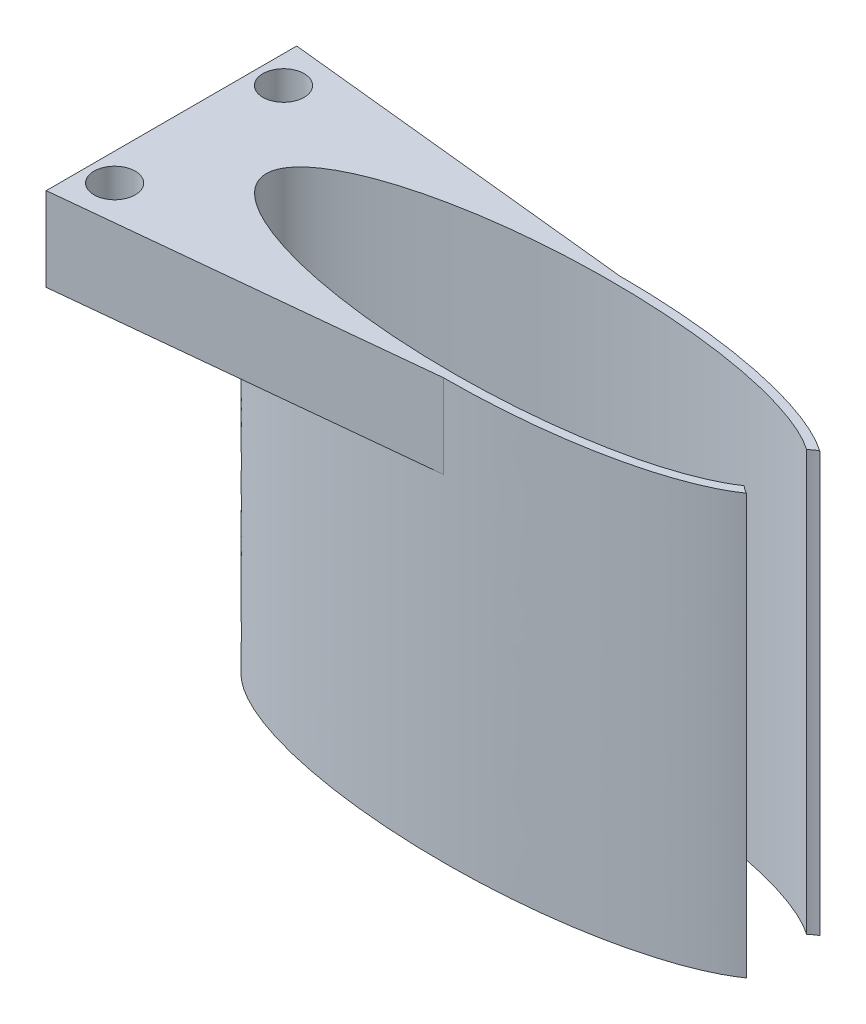
ISO-10303-21;
HEADER;
FILE_DESCRIPTION(('STEP AP214'),'2;1');
FILE_NAME('part.step','',(''),(''),'','','');
FILE_SCHEMA(('AUTOMOTIVE_DESIGN { 1 0 10303 214 1 1 1 1 }'));
ENDSEC;
DATA;
#1=APPLICATION_CONTEXT('core data for automotive mechanical design processes');
#2=APPLICATION_PROTOCOL_DEFINITION('international standard','automotive_design',2000,#1);
#3=PRODUCT_CONTEXT('',#1,'mechanical');
#4=PRODUCT('Part','Part','',(#3));
#5=PRODUCT_RELATED_PRODUCT_CATEGORY('part','',(#4));
#6=PRODUCT_DEFINITION_FORMATION('','',#4);
#7=PRODUCT_DEFINITION_CONTEXT('part definition',#1,'design');
#8=PRODUCT_DEFINITION('design','',#6,#7);
#9=PRODUCT_DEFINITION_SHAPE('','',#8);
#10=(LENGTH_UNIT() NAMED_UNIT(*) SI_UNIT(.MILLI.,.METRE.));
#11=(NAMED_UNIT(*) PLANE_ANGLE_UNIT() SI_UNIT($,.RADIAN.));
#12=(NAMED_UNIT(*) SI_UNIT($,.STERADIAN.) SOLID_ANGLE_UNIT());
#13=UNCERTAINTY_MEASURE_WITH_UNIT(LENGTH_MEASURE(1.E-05),#10,'distance_accuracy_value','');
#14=(GEOMETRIC_REPRESENTATION_CONTEXT(3) GLOBAL_UNCERTAINTY_ASSIGNED_CONTEXT((#13)) GLOBAL_UNIT_ASSIGNED_CONTEXT((#10,
#11,#12)) REPRESENTATION_CONTEXT('',''));
#15=CARTESIAN_POINT('',(0.,0.,0.));
#16=DIRECTION('',(0.,0.,1.));
#17=DIRECTION('',(1.,0.,0.));
#18=AXIS2_PLACEMENT_3D('',#15,#16,#17);
#19=CARTESIAN_POINT('',(0.,127.254,0.));
#20=DIRECTION('',(0.,1.,0.));
#21=DIRECTION('',(0.,0.,1.));
#22=AXIS2_PLACEMENT_3D('',#19,#20,#21);
#23=PLANE('',#22);
#24=CARTESIAN_POINT('',(-100.923366039771,127.254,25.4379878340144));
#25=DIRECTION('',(0.,1.,0.));
#26=DIRECTION('',(0.,0.,1.));
#27=AXIS2_PLACEMENT_3D('',#24,#25,#26);
#28=CIRCLE('',#27,6.24343983889227);
#29=CARTESIAN_POINT('',(-100.923366039771,127.254,31.6814276729067));
#30=VERTEX_POINT('',#29);
#31=EDGE_CURVE('E188',#30,#30,#28,.T.);
#32=ORIENTED_EDGE('',*,*,#31,.F.);
#33=EDGE_LOOP('',(#32));
#34=FACE_BOUND('',#33,.T.);
#35=CARTESIAN_POINT('',(-100.923366039771,127.254,-25.752966870981));
#36=DIRECTION('',(0.,1.,0.));
#37=DIRECTION('',(0.,0.,1.));
#38=AXIS2_PLACEMENT_3D('',#35,#36,#37);
#39=CIRCLE('',#38,6.24343983889227);
#40=CARTESIAN_POINT('',(-100.923366039771,127.254,-19.5095270320888));
#41=VERTEX_POINT('',#40);
#42=EDGE_CURVE('E130',#41,#41,#39,.T.);
#43=ORIENTED_EDGE('',*,*,#42,.F.);
#44=EDGE_LOOP('',(#43));
#45=FACE_BOUND('',#44,.T.);
#46=CARTESIAN_POINT('',(82.3627691038665,127.254,0.));
#47=DIRECTION('',(0.,1.,0.));
#48=DIRECTION('',(0.,0.,1.));
#49=AXIS2_PLACEMENT_3D('',#46,#47,#48);
#50=CIRCLE('',#49,12.6958795261866);
#51=CARTESIAN_POINT('',(76.2476691465208,127.254,-11.1261363219724));
#52=VERTEX_POINT('',#51);
#53=CARTESIAN_POINT('',(73.9121560052995,127.254,-9.4748348377041));
#54=VERTEX_POINT('',#53);
#55=EDGE_CURVE('E142',#52,#54,#50,.T.);
#56=ORIENTED_EDGE('',*,*,#55,.F.);
#57=CARTESIAN_POINT('',(0.,127.254,0.));
#58=DIRECTION('',(0.,1.,0.));
#59=DIRECTION('',(1.,0.,0.));
#60=AXIS2_PLACEMENT_3D('',#57,#58,#59);
#61=ELLIPSE('',#60,83.8671239744498,26.7152011392463);
#62=CARTESIAN_POINT('',(-2.92820498299235E-13,127.254,-26.7152011392463));
#63=VERTEX_POINT('',#62);
#64=EDGE_CURVE('E183',#52,#63,#61,.T.);
#65=ORIENTED_EDGE('',*,*,#64,.T.);
#66=DIRECTION('',(-0.994598800309853,0.,-0.103794154084904));
#67=VECTOR('',#66,1.);
#68=CARTESIAN_POINT('',(-2.92820498299235E-13,127.254,-26.7152011392463));
#69=LINE('',#68,#67);
#70=CARTESIAN_POINT('',(-109.288782468272,127.254,-38.1203392951836));
#71=VERTEX_POINT('',#70);
#72=EDGE_CURVE('E107',#63,#71,#69,.T.);
#73=ORIENTED_EDGE('',*,*,#72,.T.);
#74=DIRECTION('',(0.,0.,1.));
#75=VECTOR('',#74,1.);
#76=CARTESIAN_POINT('',(-109.288782468272,127.254,26.7152011392463));
#77=LINE('',#76,#75);
#78=CARTESIAN_POINT('',(-109.288782468272,127.254,37.8053602582179));
#79=VERTEX_POINT('',#78);
#80=EDGE_CURVE('E127',#71,#79,#77,.T.);
#81=ORIENTED_EDGE('',*,*,#80,.T.);
#82=DIRECTION('',(0.994890762898979,0.,-0.100957267684337));
#83=VECTOR('',#82,1.);
#84=CARTESIAN_POINT('',(8.78461494897705E-13,127.254,26.7152011392463));
#85=LINE('',#84,#83);
#86=CARTESIAN_POINT('',(8.78461494897705E-13,127.254,26.7152011392463));
#87=VERTEX_POINT('',#86);
#88=EDGE_CURVE('E51',#79,#87,#85,.T.);
#89=ORIENTED_EDGE('',*,*,#88,.T.);
#90=CARTESIAN_POINT('',(76.2476691465208,127.254,11.1261363219724));
#91=VERTEX_POINT('',#90);
#92=EDGE_CURVE('E181',#87,#91,#61,.T.);
#93=ORIENTED_EDGE('',*,*,#92,.T.);
#94=CARTESIAN_POINT('',(73.9121560052995,127.254,9.4748348377041));
#95=VERTEX_POINT('',#94);
#96=EDGE_CURVE('E138',#95,#91,#50,.T.);
#97=ORIENTED_EDGE('',*,*,#96,.F.);
#98=CARTESIAN_POINT('',(0.,127.254,0.));
#99=DIRECTION('',(0.,1.,0.));
#100=DIRECTION('',(1.,0.,0.));
#101=AXIS2_PLACEMENT_3D('',#98,#99,#100);
#102=ELLIPSE('',#101,80.4114263146468,24.0569721701671);
#103=EDGE_CURVE('E154',#54,#95,#102,.T.);
#104=ORIENTED_EDGE('',*,*,#103,.F.);
#105=EDGE_LOOP('',(#56,#65,#73,#81,#89,#93,#97,#104));
#106=FACE_BOUND('',#105,.T.);
#107=ADVANCED_FACE('F33',(#34,#45,#106),#23,.T.);
#108=CARTESIAN_POINT('',(0.,0.,0.));
#109=DIRECTION('',(0.,1.,0.));
#110=DIRECTION('',(0.,0.,1.));
#111=AXIS2_PLACEMENT_3D('',#108,#109,#110);
#112=PLANE('',#111);
#113=CARTESIAN_POINT('',(0.,0.,0.));
#114=DIRECTION('',(0.,1.,0.));
#115=DIRECTION('',(1.,0.,0.));
#116=AXIS2_PLACEMENT_3D('',#113,#114,#115);
#117=ELLIPSE('',#116,83.8671239744498,26.7152011392463);
#118=CARTESIAN_POINT('',(76.2476691465208,0.,-11.1261363219724));
#119=VERTEX_POINT('',#118);
#120=CARTESIAN_POINT('',(76.2476691465208,0.,11.1261363219724));
#121=VERTEX_POINT('',#120);
#122=EDGE_CURVE('E158',#119,#121,#117,.T.);
#123=ORIENTED_EDGE('',*,*,#122,.F.);
#124=CARTESIAN_POINT('',(82.3627691038665,0.,0.));
#125=DIRECTION('',(0.,1.,0.));
#126=DIRECTION('',(0.,0.,1.));
#127=AXIS2_PLACEMENT_3D('',#124,#125,#126);
#128=CIRCLE('',#127,12.6958795261866);
#129=CARTESIAN_POINT('',(73.9121560052995,0.,-9.4748348377041));
#130=VERTEX_POINT('',#129);
#131=EDGE_CURVE('E144',#119,#130,#128,.T.);
#132=ORIENTED_EDGE('',*,*,#131,.T.);
#133=CARTESIAN_POINT('',(0.,0.,0.));
#134=DIRECTION('',(0.,1.,0.));
#135=DIRECTION('',(1.,0.,0.));
#136=AXIS2_PLACEMENT_3D('',#133,#134,#135);
#137=ELLIPSE('',#136,80.4114263146468,24.0569721701671);
#138=CARTESIAN_POINT('',(73.9121560052995,0.,9.47483483770412));
#139=VERTEX_POINT('',#138);
#140=EDGE_CURVE('E153',#130,#139,#137,.T.);
#141=ORIENTED_EDGE('',*,*,#140,.T.);
#142=EDGE_CURVE('E58',#139,#121,#128,.T.);
#143=ORIENTED_EDGE('',*,*,#142,.T.);
#144=EDGE_LOOP('',(#123,#132,#141,#143));
#145=FACE_BOUND('',#144,.T.);
#146=ADVANCED_FACE('F169',(#145),#112,.F.);
#147=DIRECTION('',(0.,-1.,0.));
#148=VECTOR('',#147,1.);
#149=SURFACE_OF_LINEAR_EXTRUSION('',#61,#148);
#150=ORIENTED_EDGE('',*,*,#92,.F.);
#151=DIRECTION('',(0.,1.,0.));
#152=VECTOR('',#151,1.);
#153=CARTESIAN_POINT('',(8.78461494897705E-13,101.854,26.7152011392463));
#154=LINE('',#153,#152);
#155=CARTESIAN_POINT('',(8.78461494897705E-13,101.854,26.7152011392463));
#156=VERTEX_POINT('',#155);
#157=EDGE_CURVE('E125',#156,#87,#154,.T.);
#158=ORIENTED_EDGE('',*,*,#157,.F.);
#159=CARTESIAN_POINT('',(0.,101.854,0.));
#160=DIRECTION('',(0.,-1.,0.));
#161=DIRECTION('',(1.,0.,0.));
#162=AXIS2_PLACEMENT_3D('',#159,#160,#161);
#163=ELLIPSE('',#162,83.8671239744498,26.7152011392463);
#164=CARTESIAN_POINT('',(-2.92820498299235E-13,101.854,-26.7152011392463));
#165=VERTEX_POINT('',#164);
#166=EDGE_CURVE('E119',#156,#165,#163,.T.);
#167=ORIENTED_EDGE('',*,*,#166,.T.);
#168=DIRECTION('',(0.,1.,0.));
#169=VECTOR('',#168,1.);
#170=CARTESIAN_POINT('',(-2.92820498299235E-13,101.854,-26.7152011392463));
#171=LINE('',#170,#169);
#172=EDGE_CURVE('E101',#165,#63,#171,.T.);
#173=ORIENTED_EDGE('',*,*,#172,.T.);
#174=ORIENTED_EDGE('',*,*,#64,.F.);
#175=DIRECTION('',(0.,-1.,0.));
#176=VECTOR('',#175,1.);
#177=CARTESIAN_POINT('',(76.2476691465208,127.254,-11.1261363219724));
#178=LINE('',#177,#176);
#179=EDGE_CURVE('E147',#52,#119,#178,.T.);
#180=ORIENTED_EDGE('',*,*,#179,.T.);
#181=ORIENTED_EDGE('',*,*,#122,.T.);
#182=DIRECTION('',(0.,-1.,0.));
#183=VECTOR('',#182,1.);
#184=CARTESIAN_POINT('',(76.2476691465208,127.254,11.1261363219724));
#185=LINE('',#184,#183);
#186=EDGE_CURVE('E150',#121,#91,#185,.F.);
#187=ORIENTED_EDGE('',*,*,#186,.T.);
#188=EDGE_LOOP('',(#150,#158,#167,#173,#174,#180,#181,#187));
#189=FACE_BOUND('',#188,.T.);
#190=ADVANCED_FACE('F35',(#189),#149,.F.);
#191=DIRECTION('',(0.,-1.,0.));
#192=VECTOR('',#191,1.);
#193=SURFACE_OF_LINEAR_EXTRUSION('',#102,#192);
#194=DIRECTION('',(0.,-1.,0.));
#195=VECTOR('',#194,1.);
#196=CARTESIAN_POINT('',(73.9121560052995,127.254,9.4748348377041));
#197=LINE('',#196,#195);
#198=EDGE_CURVE('E11',#139,#95,#197,.F.);
#199=ORIENTED_EDGE('',*,*,#198,.F.);
#200=ORIENTED_EDGE('',*,*,#140,.F.);
#201=DIRECTION('',(0.,-1.,0.));
#202=VECTOR('',#201,1.);
#203=CARTESIAN_POINT('',(73.9121560052995,127.254,-9.4748348377041));
#204=LINE('',#203,#202);
#205=EDGE_CURVE('E43',#54,#130,#204,.T.);
#206=ORIENTED_EDGE('',*,*,#205,.F.);
#207=ORIENTED_EDGE('',*,*,#103,.T.);
#208=EDGE_LOOP('',(#199,#200,#206,#207));
#209=FACE_BOUND('',#208,.T.);
#210=ADVANCED_FACE('F160',(#209),#193,.T.);
#211=CARTESIAN_POINT('',(82.3627691038665,-30.2260000000001,0.));
#212=DIRECTION('',(0.,1.,0.));
#213=DIRECTION('',(0.,0.,1.));
#214=AXIS2_PLACEMENT_3D('',#211,#212,#213);
#215=CYLINDRICAL_SURFACE('',#214,12.6958795261866);
#216=ORIENTED_EDGE('',*,*,#55,.T.);
#217=ORIENTED_EDGE('',*,*,#205,.T.);
#218=ORIENTED_EDGE('',*,*,#131,.F.);
#219=ORIENTED_EDGE('',*,*,#179,.F.);
#220=EDGE_LOOP('',(#216,#217,#218,#219));
#221=FACE_BOUND('',#220,.T.);
#222=ADVANCED_FACE('F164',(#221),#215,.F.);
#223=ORIENTED_EDGE('',*,*,#142,.F.);
#224=ORIENTED_EDGE('',*,*,#198,.T.);
#225=ORIENTED_EDGE('',*,*,#96,.T.);
#226=ORIENTED_EDGE('',*,*,#186,.F.);
#227=EDGE_LOOP('',(#223,#224,#225,#226));
#228=FACE_BOUND('',#227,.T.);
#229=ADVANCED_FACE('F166',(#228),#215,.F.);
#230=CARTESIAN_POINT('',(8.78461494897705E-13,101.854,26.7152011392463));
#231=DIRECTION('',(0.100957267684337,0.,0.994890762898979));
#232=DIRECTION('',(0.994890762898979,0.,-0.100957267684337));
#233=AXIS2_PLACEMENT_3D('',#230,#231,#232);
#234=PLANE('',#233);
#235=ORIENTED_EDGE('',*,*,#88,.F.);
#236=DIRECTION('',(0.,1.,0.));
#237=VECTOR('',#236,1.);
#238=CARTESIAN_POINT('',(-109.288782468272,101.854,37.8053602582179));
#239=LINE('',#238,#237);
#240=CARTESIAN_POINT('',(-109.288782468272,101.854,37.8053602582179));
#241=VERTEX_POINT('',#240);
#242=EDGE_CURVE('E139',#241,#79,#239,.T.);
#243=ORIENTED_EDGE('',*,*,#242,.F.);
#244=DIRECTION('',(0.994890762898979,0.,-0.100957267684337));
#245=VECTOR('',#244,1.);
#246=CARTESIAN_POINT('',(8.78461494897705E-13,101.854,26.7152011392463));
#247=LINE('',#246,#245);
#248=EDGE_CURVE('E113',#241,#156,#247,.T.);
#249=ORIENTED_EDGE('',*,*,#248,.T.);
#250=ORIENTED_EDGE('',*,*,#157,.T.);
#251=EDGE_LOOP('',(#235,#243,#249,#250));
#252=FACE_BOUND('',#251,.T.);
#253=ADVANCED_FACE('F208',(#252),#234,.T.);
#254=CARTESIAN_POINT('',(-109.288782468272,101.854,26.7152011392463));
#255=DIRECTION('',(-1.,0.,0.));
#256=DIRECTION('',(0.,0.,1.));
#257=AXIS2_PLACEMENT_3D('',#254,#255,#256);
#258=PLANE('',#257);
#259=ORIENTED_EDGE('',*,*,#80,.F.);
#260=DIRECTION('',(0.,1.,0.));
#261=VECTOR('',#260,1.);
#262=CARTESIAN_POINT('',(-109.288782468272,101.854,-38.1203392951836));
#263=LINE('',#262,#261);
#264=CARTESIAN_POINT('',(-109.288782468272,101.854,-38.1203392951836));
#265=VERTEX_POINT('',#264);
#266=EDGE_CURVE('E112',#265,#71,#263,.T.);
#267=ORIENTED_EDGE('',*,*,#266,.F.);
#268=DIRECTION('',(0.,0.,1.));
#269=VECTOR('',#268,1.);
#270=CARTESIAN_POINT('',(-109.288782468272,101.854,-26.7152011392463));
#271=LINE('',#270,#269);
#272=EDGE_CURVE('E121',#265,#241,#271,.T.);
#273=ORIENTED_EDGE('',*,*,#272,.T.);
#274=ORIENTED_EDGE('',*,*,#242,.T.);
#275=EDGE_LOOP('',(#259,#267,#273,#274));
#276=FACE_BOUND('',#275,.T.);
#277=ADVANCED_FACE('F213',(#276),#258,.T.);
#278=CARTESIAN_POINT('',(-2.92820498299235E-13,101.854,-26.7152011392463));
#279=DIRECTION('',(0.103794154084904,0.,-0.994598800309853));
#280=DIRECTION('',(-0.994598800309853,0.,-0.103794154084904));
#281=AXIS2_PLACEMENT_3D('',#278,#279,#280);
#282=PLANE('',#281);
#283=ORIENTED_EDGE('',*,*,#72,.F.);
#284=ORIENTED_EDGE('',*,*,#172,.F.);
#285=DIRECTION('',(-0.994598800309853,0.,-0.103794154084904));
#286=VECTOR('',#285,1.);
#287=CARTESIAN_POINT('',(-2.92820498299235E-13,101.854,-26.7152011392463));
#288=LINE('',#287,#286);
#289=EDGE_CURVE('E105',#165,#265,#288,.T.);
#290=ORIENTED_EDGE('',*,*,#289,.T.);
#291=ORIENTED_EDGE('',*,*,#266,.T.);
#292=EDGE_LOOP('',(#283,#284,#290,#291));
#293=FACE_BOUND('',#292,.T.);
#294=ADVANCED_FACE('F103',(#293),#282,.T.);
#295=CARTESIAN_POINT('',(0.,101.854,0.));
#296=DIRECTION('',(0.,1.,0.));
#297=DIRECTION('',(0.,0.,1.));
#298=AXIS2_PLACEMENT_3D('',#295,#296,#297);
#299=PLANE('',#298);
#300=CARTESIAN_POINT('',(-100.923366039771,101.854,25.4379878340144));
#301=DIRECTION('',(0.,1.,0.));
#302=DIRECTION('',(0.,0.,1.));
#303=AXIS2_PLACEMENT_3D('',#300,#301,#302);
#304=CIRCLE('',#303,6.24343983889227);
#305=CARTESIAN_POINT('',(-100.923366039771,101.854,31.6814276729067));
#306=VERTEX_POINT('',#305);
#307=EDGE_CURVE('E38',#306,#306,#304,.T.);
#308=ORIENTED_EDGE('',*,*,#307,.T.);
#309=EDGE_LOOP('',(#308));
#310=FACE_BOUND('',#309,.T.);
#311=CARTESIAN_POINT('',(-100.923366039771,101.854,-25.752966870981));
#312=DIRECTION('',(0.,1.,0.));
#313=DIRECTION('',(0.,0.,1.));
#314=AXIS2_PLACEMENT_3D('',#311,#312,#313);
#315=CIRCLE('',#314,6.24343983889227);
#316=CARTESIAN_POINT('',(-100.923366039771,101.854,-19.5095270320888));
#317=VERTEX_POINT('',#316);
#318=EDGE_CURVE('E186',#317,#317,#315,.T.);
#319=ORIENTED_EDGE('',*,*,#318,.T.);
#320=EDGE_LOOP('',(#319));
#321=FACE_BOUND('',#320,.T.);
#322=ORIENTED_EDGE('',*,*,#166,.F.);
#323=ORIENTED_EDGE('',*,*,#248,.F.);
#324=ORIENTED_EDGE('',*,*,#272,.F.);
#325=ORIENTED_EDGE('',*,*,#289,.F.);
#326=EDGE_LOOP('',(#322,#323,#324,#325));
#327=FACE_BOUND('',#326,.T.);
#328=ADVANCED_FACE('F117',(#310,#321,#327),#299,.F.);
#329=CARTESIAN_POINT('',(-100.923366039771,-21.082,-25.752966870981));
#330=DIRECTION('',(0.,1.,0.));
#331=DIRECTION('',(0.,0.,1.));
#332=AXIS2_PLACEMENT_3D('',#329,#330,#331);
#333=CYLINDRICAL_SURFACE('',#332,6.24343983889227);
#334=ORIENTED_EDGE('',*,*,#42,.T.);
#335=EDGE_LOOP('',(#334));
#336=FACE_BOUND('',#335,.T.);
#337=ORIENTED_EDGE('',*,*,#318,.F.);
#338=EDGE_LOOP('',(#337));
#339=FACE_BOUND('',#338,.T.);
#340=ADVANCED_FACE('F198',(#336,#339),#333,.F.);
#341=CARTESIAN_POINT('',(-100.923366039771,-21.082,25.4379878340144));
#342=DIRECTION('',(0.,1.,0.));
#343=DIRECTION('',(0.,0.,1.));
#344=AXIS2_PLACEMENT_3D('',#341,#342,#343);
#345=CYLINDRICAL_SURFACE('',#344,6.24343983889227);
#346=ORIENTED_EDGE('',*,*,#31,.T.);
#347=EDGE_LOOP('',(#346));
#348=FACE_BOUND('',#347,.T.);
#349=ORIENTED_EDGE('',*,*,#307,.F.);
#350=EDGE_LOOP('',(#349));
#351=FACE_BOUND('',#350,.T.);
#352=ADVANCED_FACE('F277',(#348,#351),#345,.F.);
#353=CLOSED_SHELL('',(#107,#146,#190,#210,#222,#229,#253,#277,#294,#328,#340,#352));
#354=MANIFOLD_SOLID_BREP('B2',#353);
#355=ADVANCED_BREP_SHAPE_REPRESENTATION('',(#18,#354),#14);
#356=SHAPE_DEFINITION_REPRESENTATION(#9,#355);
ENDSEC;
END-ISO-10303-21;
